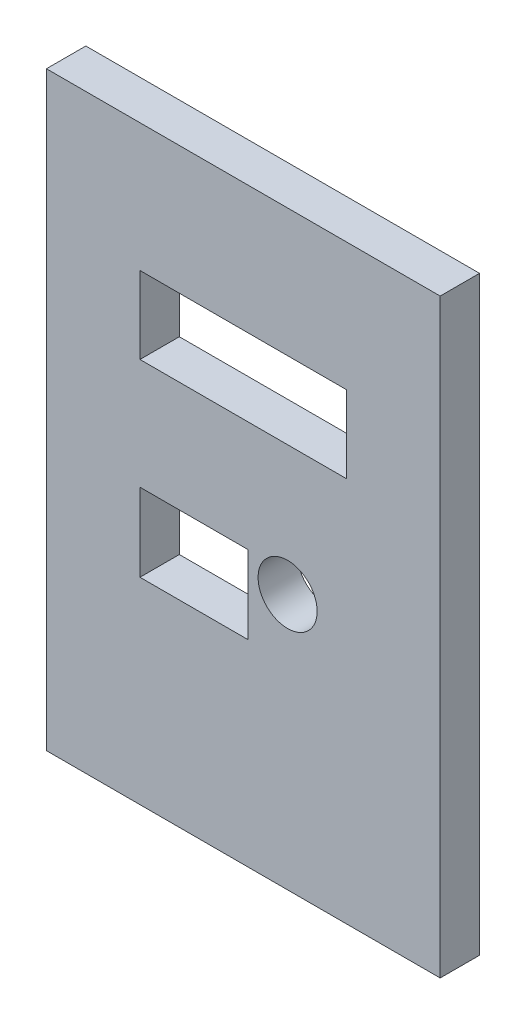
ISO-10303-21;
HEADER;
FILE_DESCRIPTION(('STEP AP214'),'2;1');
FILE_NAME('part.step','',(''),(''),'','','');
FILE_SCHEMA(('AUTOMOTIVE_DESIGN { 1 0 10303 214 1 1 1 1 }'));
ENDSEC;
DATA;
#1=APPLICATION_CONTEXT('core data for automotive mechanical design processes');
#2=APPLICATION_PROTOCOL_DEFINITION('international standard','automotive_design',2000,#1);
#3=PRODUCT_CONTEXT('',#1,'mechanical');
#4=PRODUCT('Part','Part','',(#3));
#5=PRODUCT_RELATED_PRODUCT_CATEGORY('part','',(#4));
#6=PRODUCT_DEFINITION_FORMATION('','',#4);
#7=PRODUCT_DEFINITION_CONTEXT('part definition',#1,'design');
#8=PRODUCT_DEFINITION('design','',#6,#7);
#9=PRODUCT_DEFINITION_SHAPE('','',#8);
#10=(LENGTH_UNIT() NAMED_UNIT(*) SI_UNIT(.MILLI.,.METRE.));
#11=(NAMED_UNIT(*) PLANE_ANGLE_UNIT() SI_UNIT($,.RADIAN.));
#12=(NAMED_UNIT(*) SI_UNIT($,.STERADIAN.) SOLID_ANGLE_UNIT());
#13=UNCERTAINTY_MEASURE_WITH_UNIT(LENGTH_MEASURE(1.E-05),#10,'distance_accuracy_value','');
#14=(GEOMETRIC_REPRESENTATION_CONTEXT(3) GLOBAL_UNCERTAINTY_ASSIGNED_CONTEXT((#13)) GLOBAL_UNIT_ASSIGNED_CONTEXT((#10,
#11,#12)) REPRESENTATION_CONTEXT('',''));
#15=CARTESIAN_POINT('',(0.,0.,0.));
#16=DIRECTION('',(0.,0.,1.));
#17=DIRECTION('',(1.,0.,0.));
#18=AXIS2_PLACEMENT_3D('',#15,#16,#17);
#19=CARTESIAN_POINT('',(0.,0.,2.));
#20=DIRECTION('',(0.,0.,1.));
#21=DIRECTION('',(1.,0.,0.));
#22=AXIS2_PLACEMENT_3D('',#19,#20,#21);
#23=PLANE('',#22);
#24=CARTESIAN_POINT('',(2.25,-2.,2.));
#25=DIRECTION('',(0.,0.,1.));
#26=DIRECTION('',(1.,0.,0.));
#27=AXIS2_PLACEMENT_3D('',#24,#25,#26);
#28=CIRCLE('',#27,1.5);
#29=CARTESIAN_POINT('',(3.75,-2.,2.));
#30=VERTEX_POINT('',#29);
#31=EDGE_CURVE('E223',#30,#30,#28,.T.);
#32=ORIENTED_EDGE('',*,*,#31,.F.);
#33=EDGE_LOOP('',(#32));
#34=FACE_BOUND('',#33,.T.);
#35=DIRECTION('',(0.,1.,0.));
#36=VECTOR('',#35,1.);
#37=CARTESIAN_POINT('',(0.249999999999999,0.,2.));
#38=LINE('',#37,#36);
#39=CARTESIAN_POINT('',(0.249999999999999,-4.99598046327325,2.));
#40=VERTEX_POINT('',#39);
#41=CARTESIAN_POINT('',(0.249999999999999,-1.03441005186714,2.));
#42=VERTEX_POINT('',#41);
#43=EDGE_CURVE('E49',#40,#42,#38,.T.);
#44=ORIENTED_EDGE('',*,*,#43,.F.);
#45=DIRECTION('',(-1.,0.,0.));
#46=VECTOR('',#45,1.);
#47=CARTESIAN_POINT('',(0.,-4.99598046327325,2.));
#48=LINE('',#47,#46);
#49=CARTESIAN_POINT('',(-5.25,-4.99598046327325,2.));
#50=VERTEX_POINT('',#49);
#51=EDGE_CURVE('E141',#40,#50,#48,.T.);
#52=ORIENTED_EDGE('',*,*,#51,.T.);
#53=DIRECTION('',(0.,1.,0.));
#54=VECTOR('',#53,1.);
#55=CARTESIAN_POINT('',(-5.25,0.,2.));
#56=LINE('',#55,#54);
#57=CARTESIAN_POINT('',(-5.25,-1.03441005186715,2.));
#58=VERTEX_POINT('',#57);
#59=EDGE_CURVE('E126',#50,#58,#56,.T.);
#60=ORIENTED_EDGE('',*,*,#59,.T.);
#61=DIRECTION('',(-1.,0.,0.));
#62=VECTOR('',#61,1.);
#63=CARTESIAN_POINT('',(0.,-1.03441005186714,2.));
#64=LINE('',#63,#62);
#65=EDGE_CURVE('E135',#42,#58,#64,.T.);
#66=ORIENTED_EDGE('',*,*,#65,.F.);
#67=EDGE_LOOP('',(#44,#52,#60,#66));
#68=FACE_BOUND('',#67,.T.);
#69=DIRECTION('',(0.,-1.,0.));
#70=VECTOR('',#69,1.);
#71=CARTESIAN_POINT('',(-10.,-15.,2.));
#72=LINE('',#71,#70);
#73=CARTESIAN_POINT('',(-10.,15.,2.));
#74=VERTEX_POINT('',#73);
#75=CARTESIAN_POINT('',(-10.,-15.,2.));
#76=VERTEX_POINT('',#75);
#77=EDGE_CURVE('E172',#74,#76,#72,.T.);
#78=ORIENTED_EDGE('',*,*,#77,.T.);
#79=DIRECTION('',(1.,0.,0.));
#80=VECTOR('',#79,1.);
#81=CARTESIAN_POINT('',(10.,-15.,2.));
#82=LINE('',#81,#80);
#83=CARTESIAN_POINT('',(10.,-15.,2.));
#84=VERTEX_POINT('',#83);
#85=EDGE_CURVE('E175',#76,#84,#82,.T.);
#86=ORIENTED_EDGE('',*,*,#85,.T.);
#87=DIRECTION('',(0.,1.,0.));
#88=VECTOR('',#87,1.);
#89=CARTESIAN_POINT('',(10.,-15.,2.));
#90=LINE('',#89,#88);
#91=CARTESIAN_POINT('',(10.,15.,2.));
#92=VERTEX_POINT('',#91);
#93=EDGE_CURVE('E178',#84,#92,#90,.T.);
#94=ORIENTED_EDGE('',*,*,#93,.T.);
#95=DIRECTION('',(-1.,0.,0.));
#96=VECTOR('',#95,1.);
#97=CARTESIAN_POINT('',(10.,15.,2.));
#98=LINE('',#97,#96);
#99=EDGE_CURVE('E180',#92,#74,#98,.T.);
#100=ORIENTED_EDGE('',*,*,#99,.T.);
#101=EDGE_LOOP('',(#78,#86,#94,#100));
#102=FACE_BOUND('',#101,.T.);
#103=DIRECTION('',(0.,1.,0.));
#104=VECTOR('',#103,1.);
#105=CARTESIAN_POINT('',(5.25,0.,2.));
#106=LINE('',#105,#104);
#107=CARTESIAN_POINT('',(5.25,4.58463092608489,2.));
#108=VERTEX_POINT('',#107);
#109=CARTESIAN_POINT('',(5.25,8.5,2.));
#110=VERTEX_POINT('',#109);
#111=EDGE_CURVE('E153',#108,#110,#106,.T.);
#112=ORIENTED_EDGE('',*,*,#111,.F.);
#113=DIRECTION('',(-1.,0.,0.));
#114=VECTOR('',#113,1.);
#115=CARTESIAN_POINT('',(0.,4.58463092608489,2.));
#116=LINE('',#115,#114);
#117=CARTESIAN_POINT('',(-5.25,4.58463092608489,2.));
#118=VERTEX_POINT('',#117);
#119=EDGE_CURVE('E148',#108,#118,#116,.T.);
#120=ORIENTED_EDGE('',*,*,#119,.T.);
#121=DIRECTION('',(0.,1.,0.));
#122=VECTOR('',#121,1.);
#123=CARTESIAN_POINT('',(-5.25,0.,2.));
#124=LINE('',#123,#122);
#125=CARTESIAN_POINT('',(-5.25,8.50000000000001,2.));
#126=VERTEX_POINT('',#125);
#127=EDGE_CURVE('E159',#118,#126,#124,.T.);
#128=ORIENTED_EDGE('',*,*,#127,.T.);
#129=DIRECTION('',(-1.,0.,0.));
#130=VECTOR('',#129,1.);
#131=CARTESIAN_POINT('',(0.,8.5,2.));
#132=LINE('',#131,#130);
#133=EDGE_CURVE('E156',#110,#126,#132,.T.);
#134=ORIENTED_EDGE('',*,*,#133,.F.);
#135=EDGE_LOOP('',(#112,#120,#128,#134));
#136=FACE_BOUND('',#135,.T.);
#137=ADVANCED_FACE('F33',(#34,#68,#102,#136),#23,.T.);
#138=CARTESIAN_POINT('',(0.,0.,0.));
#139=DIRECTION('',(0.,0.,1.));
#140=DIRECTION('',(1.,0.,0.));
#141=AXIS2_PLACEMENT_3D('',#138,#139,#140);
#142=PLANE('',#141);
#143=CARTESIAN_POINT('',(2.25,-2.,0.));
#144=DIRECTION('',(0.,0.,1.));
#145=DIRECTION('',(1.,0.,0.));
#146=AXIS2_PLACEMENT_3D('',#143,#144,#145);
#147=CIRCLE('',#146,1.5);
#148=CARTESIAN_POINT('',(3.75,-2.,0.));
#149=VERTEX_POINT('',#148);
#150=EDGE_CURVE('E37',#149,#149,#147,.T.);
#151=ORIENTED_EDGE('',*,*,#150,.T.);
#152=EDGE_LOOP('',(#151));
#153=FACE_BOUND('',#152,.T.);
#154=DIRECTION('',(-1.,0.,0.));
#155=VECTOR('',#154,1.);
#156=CARTESIAN_POINT('',(0.,-4.99598046327325,0.));
#157=LINE('',#156,#155);
#158=CARTESIAN_POINT('',(0.249999999999999,-4.99598046327325,0.));
#159=VERTEX_POINT('',#158);
#160=CARTESIAN_POINT('',(-5.25,-4.99598046327325,0.));
#161=VERTEX_POINT('',#160);
#162=EDGE_CURVE('E42',#159,#161,#157,.T.);
#163=ORIENTED_EDGE('',*,*,#162,.F.);
#164=DIRECTION('',(0.,1.,0.));
#165=VECTOR('',#164,1.);
#166=CARTESIAN_POINT('',(0.249999999999999,0.,0.));
#167=LINE('',#166,#165);
#168=CARTESIAN_POINT('',(0.249999999999999,-1.03441005186714,0.));
#169=VERTEX_POINT('',#168);
#170=EDGE_CURVE('E11',#159,#169,#167,.T.);
#171=ORIENTED_EDGE('',*,*,#170,.T.);
#172=DIRECTION('',(-1.,0.,0.));
#173=VECTOR('',#172,1.);
#174=CARTESIAN_POINT('',(0.,-1.03441005186714,0.));
#175=LINE('',#174,#173);
#176=CARTESIAN_POINT('',(-5.25,-1.03441005186715,0.));
#177=VERTEX_POINT('',#176);
#178=EDGE_CURVE('E211',#169,#177,#175,.T.);
#179=ORIENTED_EDGE('',*,*,#178,.T.);
#180=DIRECTION('',(0.,1.,0.));
#181=VECTOR('',#180,1.);
#182=CARTESIAN_POINT('',(-5.25,0.,0.));
#183=LINE('',#182,#181);
#184=EDGE_CURVE('E129',#161,#177,#183,.T.);
#185=ORIENTED_EDGE('',*,*,#184,.F.);
#186=EDGE_LOOP('',(#163,#171,#179,#185));
#187=FACE_BOUND('',#186,.T.);
#188=DIRECTION('',(0.,-1.,0.));
#189=VECTOR('',#188,1.);
#190=CARTESIAN_POINT('',(-10.,-15.,0.));
#191=LINE('',#190,#189);
#192=CARTESIAN_POINT('',(-10.,15.,0.));
#193=VERTEX_POINT('',#192);
#194=CARTESIAN_POINT('',(-10.,-15.,0.));
#195=VERTEX_POINT('',#194);
#196=EDGE_CURVE('E165',#193,#195,#191,.T.);
#197=ORIENTED_EDGE('',*,*,#196,.F.);
#198=DIRECTION('',(-1.,0.,0.));
#199=VECTOR('',#198,1.);
#200=CARTESIAN_POINT('',(10.,15.,0.));
#201=LINE('',#200,#199);
#202=CARTESIAN_POINT('',(10.,15.,0.));
#203=VERTEX_POINT('',#202);
#204=EDGE_CURVE('E176',#203,#193,#201,.T.);
#205=ORIENTED_EDGE('',*,*,#204,.F.);
#206=DIRECTION('',(0.,1.,0.));
#207=VECTOR('',#206,1.);
#208=CARTESIAN_POINT('',(10.,-15.,0.));
#209=LINE('',#208,#207);
#210=CARTESIAN_POINT('',(10.,-15.,0.));
#211=VERTEX_POINT('',#210);
#212=EDGE_CURVE('E187',#211,#203,#209,.T.);
#213=ORIENTED_EDGE('',*,*,#212,.F.);
#214=DIRECTION('',(1.,0.,0.));
#215=VECTOR('',#214,1.);
#216=CARTESIAN_POINT('',(10.,-15.,0.));
#217=LINE('',#216,#215);
#218=EDGE_CURVE('E185',#195,#211,#217,.T.);
#219=ORIENTED_EDGE('',*,*,#218,.F.);
#220=EDGE_LOOP('',(#197,#205,#213,#219));
#221=FACE_BOUND('',#220,.T.);
#222=DIRECTION('',(-1.,0.,0.));
#223=VECTOR('',#222,1.);
#224=CARTESIAN_POINT('',(0.,4.58463092608489,0.));
#225=LINE('',#224,#223);
#226=CARTESIAN_POINT('',(5.25,4.58463092608489,0.));
#227=VERTEX_POINT('',#226);
#228=CARTESIAN_POINT('',(-5.25,4.58463092608489,0.));
#229=VERTEX_POINT('',#228);
#230=EDGE_CURVE('E209',#227,#229,#225,.T.);
#231=ORIENTED_EDGE('',*,*,#230,.F.);
#232=DIRECTION('',(0.,1.,0.));
#233=VECTOR('',#232,1.);
#234=CARTESIAN_POINT('',(5.25,0.,0.));
#235=LINE('',#234,#233);
#236=CARTESIAN_POINT('',(5.25,8.5,0.));
#237=VERTEX_POINT('',#236);
#238=EDGE_CURVE('E201',#227,#237,#235,.T.);
#239=ORIENTED_EDGE('',*,*,#238,.T.);
#240=DIRECTION('',(-1.,0.,0.));
#241=VECTOR('',#240,1.);
#242=CARTESIAN_POINT('',(0.,8.5,0.));
#243=LINE('',#242,#241);
#244=CARTESIAN_POINT('',(-5.25,8.50000000000001,0.));
#245=VERTEX_POINT('',#244);
#246=EDGE_CURVE('E204',#237,#245,#243,.T.);
#247=ORIENTED_EDGE('',*,*,#246,.T.);
#248=DIRECTION('',(0.,1.,0.));
#249=VECTOR('',#248,1.);
#250=CARTESIAN_POINT('',(-5.25,0.,0.));
#251=LINE('',#250,#249);
#252=EDGE_CURVE('E207',#229,#245,#251,.T.);
#253=ORIENTED_EDGE('',*,*,#252,.F.);
#254=EDGE_LOOP('',(#231,#239,#247,#253));
#255=FACE_BOUND('',#254,.T.);
#256=ADVANCED_FACE('F219',(#153,#187,#221,#255),#142,.F.);
#257=CARTESIAN_POINT('',(-10.,-15.,2.));
#258=DIRECTION('',(1.,0.,0.));
#259=DIRECTION('',(0.,0.,-1.));
#260=AXIS2_PLACEMENT_3D('',#257,#258,#259);
#261=PLANE('',#260);
#262=ORIENTED_EDGE('',*,*,#196,.T.);
#263=DIRECTION('',(0.,0.,-1.));
#264=VECTOR('',#263,1.);
#265=CARTESIAN_POINT('',(-10.,-15.,2.));
#266=LINE('',#265,#264);
#267=EDGE_CURVE('E198',#76,#195,#266,.T.);
#268=ORIENTED_EDGE('',*,*,#267,.F.);
#269=ORIENTED_EDGE('',*,*,#77,.F.);
#270=DIRECTION('',(0.,0.,-1.));
#271=VECTOR('',#270,1.);
#272=CARTESIAN_POINT('',(-10.,15.,2.));
#273=LINE('',#272,#271);
#274=EDGE_CURVE('E182',#74,#193,#273,.T.);
#275=ORIENTED_EDGE('',*,*,#274,.T.);
#276=EDGE_LOOP('',(#262,#268,#269,#275));
#277=FACE_BOUND('',#276,.T.);
#278=ADVANCED_FACE('F35',(#277),#261,.F.);
#279=CARTESIAN_POINT('',(10.,-15.,2.));
#280=DIRECTION('',(0.,1.,0.));
#281=DIRECTION('',(-1.,0.,0.));
#282=AXIS2_PLACEMENT_3D('',#279,#280,#281);
#283=PLANE('',#282);
#284=ORIENTED_EDGE('',*,*,#218,.T.);
#285=DIRECTION('',(0.,0.,-1.));
#286=VECTOR('',#285,1.);
#287=CARTESIAN_POINT('',(10.,-15.,2.));
#288=LINE('',#287,#286);
#289=EDGE_CURVE('E195',#84,#211,#288,.T.);
#290=ORIENTED_EDGE('',*,*,#289,.F.);
#291=ORIENTED_EDGE('',*,*,#85,.F.);
#292=ORIENTED_EDGE('',*,*,#267,.T.);
#293=EDGE_LOOP('',(#284,#290,#291,#292));
#294=FACE_BOUND('',#293,.T.);
#295=ADVANCED_FACE('F248',(#294),#283,.F.);
#296=CARTESIAN_POINT('',(10.,-15.,2.));
#297=DIRECTION('',(-1.,0.,0.));
#298=DIRECTION('',(0.,0.,1.));
#299=AXIS2_PLACEMENT_3D('',#296,#297,#298);
#300=PLANE('',#299);
#301=ORIENTED_EDGE('',*,*,#212,.T.);
#302=DIRECTION('',(0.,0.,-1.));
#303=VECTOR('',#302,1.);
#304=CARTESIAN_POINT('',(10.,15.,2.));
#305=LINE('',#304,#303);
#306=EDGE_CURVE('E192',#92,#203,#305,.T.);
#307=ORIENTED_EDGE('',*,*,#306,.F.);
#308=ORIENTED_EDGE('',*,*,#93,.F.);
#309=ORIENTED_EDGE('',*,*,#289,.T.);
#310=EDGE_LOOP('',(#301,#307,#308,#309));
#311=FACE_BOUND('',#310,.T.);
#312=ADVANCED_FACE('F245',(#311),#300,.F.);
#313=CARTESIAN_POINT('',(10.,15.,2.));
#314=DIRECTION('',(0.,-1.,0.));
#315=DIRECTION('',(1.,0.,0.));
#316=AXIS2_PLACEMENT_3D('',#313,#314,#315);
#317=PLANE('',#316);
#318=ORIENTED_EDGE('',*,*,#204,.T.);
#319=ORIENTED_EDGE('',*,*,#274,.F.);
#320=ORIENTED_EDGE('',*,*,#99,.F.);
#321=ORIENTED_EDGE('',*,*,#306,.T.);
#322=EDGE_LOOP('',(#318,#319,#320,#321));
#323=FACE_BOUND('',#322,.T.);
#324=ADVANCED_FACE('F242',(#323),#317,.F.);
#325=CARTESIAN_POINT('',(0.,4.58463092608489,-8.));
#326=DIRECTION('',(0.,1.,0.));
#327=DIRECTION('',(0.,0.,1.));
#328=AXIS2_PLACEMENT_3D('',#325,#326,#327);
#329=PLANE('',#328);
#330=ORIENTED_EDGE('',*,*,#230,.T.);
#331=DIRECTION('',(0.,0.,1.));
#332=VECTOR('',#331,1.);
#333=CARTESIAN_POINT('',(-5.25,4.58463092608489,-8.));
#334=LINE('',#333,#332);
#335=EDGE_CURVE('E163',#229,#118,#334,.T.);
#336=ORIENTED_EDGE('',*,*,#335,.T.);
#337=ORIENTED_EDGE('',*,*,#119,.F.);
#338=DIRECTION('',(0.,0.,1.));
#339=VECTOR('',#338,1.);
#340=CARTESIAN_POINT('',(5.25,4.58463092608489,-8.));
#341=LINE('',#340,#339);
#342=EDGE_CURVE('E162',#227,#108,#341,.T.);
#343=ORIENTED_EDGE('',*,*,#342,.F.);
#344=EDGE_LOOP('',(#330,#336,#337,#343));
#345=FACE_BOUND('',#344,.T.);
#346=ADVANCED_FACE('F239',(#345),#329,.T.);
#347=CARTESIAN_POINT('',(-5.25,0.,-8.));
#348=DIRECTION('',(1.,0.,0.));
#349=DIRECTION('',(0.,1.,0.));
#350=AXIS2_PLACEMENT_3D('',#347,#348,#349);
#351=PLANE('',#350);
#352=ORIENTED_EDGE('',*,*,#252,.T.);
#353=DIRECTION('',(0.,0.,1.));
#354=VECTOR('',#353,1.);
#355=CARTESIAN_POINT('',(-5.25,8.50000000000001,-8.));
#356=LINE('',#355,#354);
#357=EDGE_CURVE('E166',#245,#126,#356,.T.);
#358=ORIENTED_EDGE('',*,*,#357,.T.);
#359=ORIENTED_EDGE('',*,*,#127,.F.);
#360=ORIENTED_EDGE('',*,*,#335,.F.);
#361=EDGE_LOOP('',(#352,#358,#359,#360));
#362=FACE_BOUND('',#361,.T.);
#363=ADVANCED_FACE('F280',(#362),#351,.T.);
#364=CARTESIAN_POINT('',(0.,8.5,-8.));
#365=DIRECTION('',(0.,1.,0.));
#366=DIRECTION('',(-1.,0.,0.));
#367=AXIS2_PLACEMENT_3D('',#364,#365,#366);
#368=PLANE('',#367);
#369=DIRECTION('',(0.,0.,1.));
#370=VECTOR('',#369,1.);
#371=CARTESIAN_POINT('',(5.25,8.5,-8.));
#372=LINE('',#371,#370);
#373=EDGE_CURVE('E168',#237,#110,#372,.T.);
#374=ORIENTED_EDGE('',*,*,#373,.T.);
#375=ORIENTED_EDGE('',*,*,#133,.T.);
#376=ORIENTED_EDGE('',*,*,#357,.F.);
#377=ORIENTED_EDGE('',*,*,#246,.F.);
#378=EDGE_LOOP('',(#374,#375,#376,#377));
#379=FACE_BOUND('',#378,.T.);
#380=ADVANCED_FACE('F283',(#379),#368,.F.);
#381=CARTESIAN_POINT('',(5.25,0.,-8.));
#382=DIRECTION('',(1.,0.,0.));
#383=DIRECTION('',(0.,0.,-1.));
#384=AXIS2_PLACEMENT_3D('',#381,#382,#383);
#385=PLANE('',#384);
#386=ORIENTED_EDGE('',*,*,#342,.T.);
#387=ORIENTED_EDGE('',*,*,#111,.T.);
#388=ORIENTED_EDGE('',*,*,#373,.F.);
#389=ORIENTED_EDGE('',*,*,#238,.F.);
#390=EDGE_LOOP('',(#386,#387,#388,#389));
#391=FACE_BOUND('',#390,.T.);
#392=ADVANCED_FACE('F271',(#391),#385,.F.);
#393=CARTESIAN_POINT('',(0.249999999999999,0.,-8.));
#394=DIRECTION('',(1.,0.,0.));
#395=DIRECTION('',(0.,0.,-1.));
#396=AXIS2_PLACEMENT_3D('',#393,#394,#395);
#397=PLANE('',#396);
#398=DIRECTION('',(0.,0.,1.));
#399=VECTOR('',#398,1.);
#400=CARTESIAN_POINT('',(0.249999999999999,-4.99598046327325,-8.));
#401=LINE('',#400,#399);
#402=EDGE_CURVE('E146',#159,#40,#401,.T.);
#403=ORIENTED_EDGE('',*,*,#402,.T.);
#404=ORIENTED_EDGE('',*,*,#43,.T.);
#405=DIRECTION('',(0.,0.,1.));
#406=VECTOR('',#405,1.);
#407=CARTESIAN_POINT('',(0.249999999999999,-1.03441005186714,-8.));
#408=LINE('',#407,#406);
#409=EDGE_CURVE('E132',#169,#42,#408,.T.);
#410=ORIENTED_EDGE('',*,*,#409,.F.);
#411=ORIENTED_EDGE('',*,*,#170,.F.);
#412=EDGE_LOOP('',(#403,#404,#410,#411));
#413=FACE_BOUND('',#412,.T.);
#414=ADVANCED_FACE('F221',(#413),#397,.F.);
#415=CARTESIAN_POINT('',(0.,-4.99598046327325,-8.));
#416=DIRECTION('',(0.,1.,0.));
#417=DIRECTION('',(0.,0.,1.));
#418=AXIS2_PLACEMENT_3D('',#415,#416,#417);
#419=PLANE('',#418);
#420=ORIENTED_EDGE('',*,*,#162,.T.);
#421=DIRECTION('',(0.,0.,1.));
#422=VECTOR('',#421,1.);
#423=CARTESIAN_POINT('',(-5.25,-4.99598046327325,-8.));
#424=LINE('',#423,#422);
#425=EDGE_CURVE('E131',#161,#50,#424,.T.);
#426=ORIENTED_EDGE('',*,*,#425,.T.);
#427=ORIENTED_EDGE('',*,*,#51,.F.);
#428=ORIENTED_EDGE('',*,*,#402,.F.);
#429=EDGE_LOOP('',(#420,#426,#427,#428));
#430=FACE_BOUND('',#429,.T.);
#431=ADVANCED_FACE('F217',(#430),#419,.T.);
#432=CARTESIAN_POINT('',(-5.25,0.,-8.));
#433=DIRECTION('',(1.,0.,0.));
#434=DIRECTION('',(0.,1.,0.));
#435=AXIS2_PLACEMENT_3D('',#432,#433,#434);
#436=PLANE('',#435);
#437=ORIENTED_EDGE('',*,*,#184,.T.);
#438=DIRECTION('',(0.,0.,1.));
#439=VECTOR('',#438,1.);
#440=CARTESIAN_POINT('',(-5.25,-1.03441005186715,-8.));
#441=LINE('',#440,#439);
#442=EDGE_CURVE('E57',#177,#58,#441,.T.);
#443=ORIENTED_EDGE('',*,*,#442,.T.);
#444=ORIENTED_EDGE('',*,*,#59,.F.);
#445=ORIENTED_EDGE('',*,*,#425,.F.);
#446=EDGE_LOOP('',(#437,#443,#444,#445));
#447=FACE_BOUND('',#446,.T.);
#448=ADVANCED_FACE('F123',(#447),#436,.T.);
#449=CARTESIAN_POINT('',(0.,-1.03441005186714,-8.));
#450=DIRECTION('',(0.,1.,0.));
#451=DIRECTION('',(-1.,0.,0.));
#452=AXIS2_PLACEMENT_3D('',#449,#450,#451);
#453=PLANE('',#452);
#454=ORIENTED_EDGE('',*,*,#409,.T.);
#455=ORIENTED_EDGE('',*,*,#65,.T.);
#456=ORIENTED_EDGE('',*,*,#442,.F.);
#457=ORIENTED_EDGE('',*,*,#178,.F.);
#458=EDGE_LOOP('',(#454,#455,#456,#457));
#459=FACE_BOUND('',#458,.T.);
#460=ADVANCED_FACE('F136',(#459),#453,.F.);
#461=CARTESIAN_POINT('',(2.25,-2.,-8.));
#462=DIRECTION('',(0.,0.,1.));
#463=DIRECTION('',(1.,0.,0.));
#464=AXIS2_PLACEMENT_3D('',#461,#462,#463);
#465=CYLINDRICAL_SURFACE('',#464,1.5);
#466=ORIENTED_EDGE('',*,*,#31,.T.);
#467=EDGE_LOOP('',(#466));
#468=FACE_BOUND('',#467,.T.);
#469=ORIENTED_EDGE('',*,*,#150,.F.);
#470=EDGE_LOOP('',(#469));
#471=FACE_BOUND('',#470,.T.);
#472=ADVANCED_FACE('F228',(#468,#471),#465,.F.);
#473=CLOSED_SHELL('',(#137,#256,#278,#295,#312,#324,#346,#363,#380,#392,#414,#431,#448,#460,#472));
#474=MANIFOLD_SOLID_BREP('B2',#473);
#475=ADVANCED_BREP_SHAPE_REPRESENTATION('',(#18,#474),#14);
#476=SHAPE_DEFINITION_REPRESENTATION(#9,#475);
ENDSEC;
END-ISO-10303-21;
